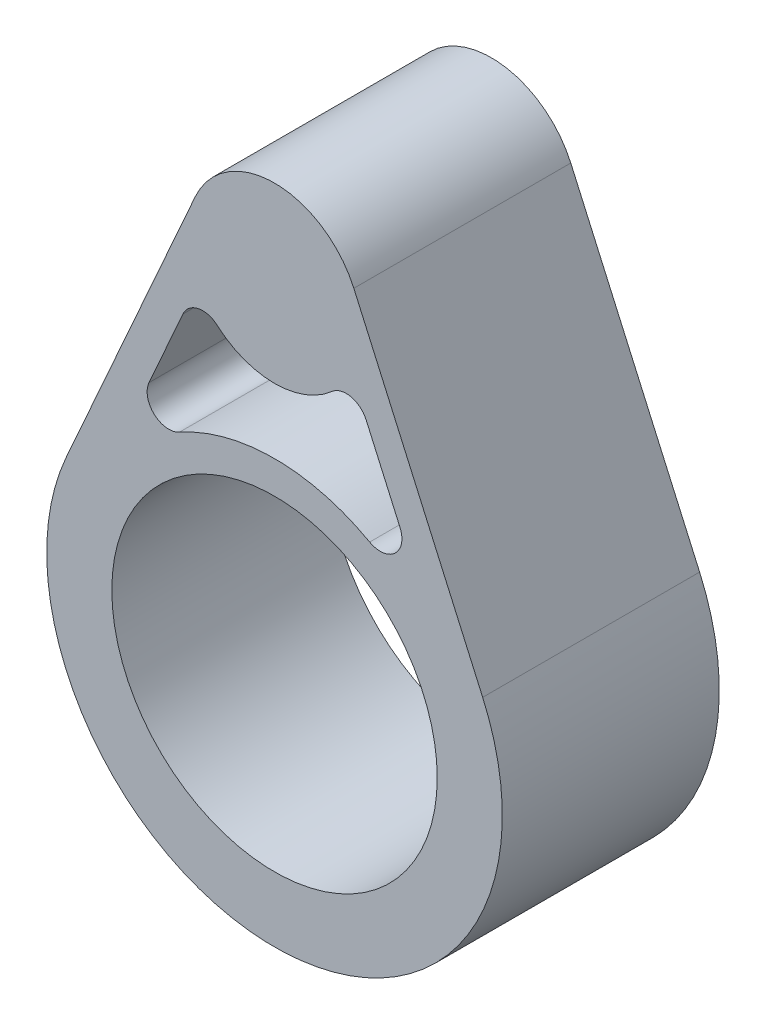
ISO-10303-21;
HEADER;
FILE_DESCRIPTION(('STEP AP214'),'2;1');
FILE_NAME('part.step','',(''),(''),'','','');
FILE_SCHEMA(('AUTOMOTIVE_DESIGN { 1 0 10303 214 1 1 1 1 }'));
ENDSEC;
DATA;
#1=APPLICATION_CONTEXT('core data for automotive mechanical design processes');
#2=APPLICATION_PROTOCOL_DEFINITION('international standard','automotive_design',2000,#1);
#3=PRODUCT_CONTEXT('',#1,'mechanical');
#4=PRODUCT('Part','Part','',(#3));
#5=PRODUCT_RELATED_PRODUCT_CATEGORY('part','',(#4));
#6=PRODUCT_DEFINITION_FORMATION('','',#4);
#7=PRODUCT_DEFINITION_CONTEXT('part definition',#1,'design');
#8=PRODUCT_DEFINITION('design','',#6,#7);
#9=PRODUCT_DEFINITION_SHAPE('','',#8);
#10=(LENGTH_UNIT() NAMED_UNIT(*) SI_UNIT(.MILLI.,.METRE.));
#11=(NAMED_UNIT(*) PLANE_ANGLE_UNIT() SI_UNIT($,.RADIAN.));
#12=(NAMED_UNIT(*) SI_UNIT($,.STERADIAN.) SOLID_ANGLE_UNIT());
#13=UNCERTAINTY_MEASURE_WITH_UNIT(LENGTH_MEASURE(1.E-05),#10,'distance_accuracy_value','');
#14=(GEOMETRIC_REPRESENTATION_CONTEXT(3) GLOBAL_UNCERTAINTY_ASSIGNED_CONTEXT((#13)) GLOBAL_UNIT_ASSIGNED_CONTEXT((#10,
#11,#12)) REPRESENTATION_CONTEXT('',''));
#15=CARTESIAN_POINT('',(0.,0.,0.));
#16=DIRECTION('',(0.,0.,1.));
#17=DIRECTION('',(1.,0.,0.));
#18=AXIS2_PLACEMENT_3D('',#15,#16,#17);
#19=CARTESIAN_POINT('',(0.,-160.,50.));
#20=DIRECTION('',(0.,0.,1.));
#21=DIRECTION('',(1.,0.,0.));
#22=AXIS2_PLACEMENT_3D('',#19,#20,#21);
#23=PLANE('',#22);
#24=CARTESIAN_POINT('',(0.,0.,50.));
#25=DIRECTION('',(0.,0.,-1.));
#26=DIRECTION('',(1.,0.,0.));
#27=AXIS2_PLACEMENT_3D('',#24,#25,#26);
#28=CIRCLE('',#27,40.);
#29=CARTESIAN_POINT('',(26.4666556609354,-29.9919345512335,50.));
#30=VERTEX_POINT('',#29);
#31=CARTESIAN_POINT('',(-26.4666556609355,-29.9919345512335,50.));
#32=VERTEX_POINT('',#31);
#33=EDGE_CURVE('E192',#30,#32,#28,.T.);
#34=ORIENTED_EDGE('',*,*,#33,.F.);
#35=CARTESIAN_POINT('',(33.0833195761693,-37.4899181890419,50.));
#36=DIRECTION('',(0.,0.,1.));
#37=DIRECTION('',(1.,0.,0.));
#38=AXIS2_PLACEMENT_3D('',#35,#36,#37);
#39=CIRCLE('',#38,10.);
#40=CARTESIAN_POINT('',(42.2209392744277,-33.4274181890419,50.));
#41=VERTEX_POINT('',#40);
#42=EDGE_CURVE('E176',#30,#41,#39,.F.);
#43=ORIENTED_EDGE('',*,*,#42,.T.);
#44=DIRECTION('',(-0.40625,0.91376196982584,0.));
#45=VECTOR('',#44,1.);
#46=CARTESIAN_POINT('',(82.2385772843257,-123.4375,50.));
#47=LINE('',#46,#45);
#48=CARTESIAN_POINT('',(57.8635772843256,-68.6117818104496,50.));
#49=VERTEX_POINT('',#48);
#50=EDGE_CURVE('E272',#49,#41,#47,.T.);
#51=ORIENTED_EDGE('',*,*,#50,.F.);
#52=CARTESIAN_POINT('',(48.7259575860672,-72.6742818104496,50.));
#53=DIRECTION('',(0.,0.,1.));
#54=DIRECTION('',(1.,0.,0.));
#55=AXIS2_PLACEMENT_3D('',#52,#53,#54);
#56=CIRCLE('',#55,10.);
#57=CARTESIAN_POINT('',(43.8533618274605,-81.4068536294046,50.));
#58=VERTEX_POINT('',#57);
#59=EDGE_CURVE('E49',#49,#58,#56,.F.);
#60=ORIENTED_EDGE('',*,*,#59,.T.);
#61=CARTESIAN_POINT('',(0.,-160.,50.));
#62=DIRECTION('',(0.,0.,-1.));
#63=DIRECTION('',(1.,0.,0.));
#64=AXIS2_PLACEMENT_3D('',#61,#62,#63);
#65=CIRCLE('',#64,90.);
#66=CARTESIAN_POINT('',(-43.8533618274605,-81.4068536294046,50.));
#67=VERTEX_POINT('',#66);
#68=EDGE_CURVE('E186',#67,#58,#65,.T.);
#69=ORIENTED_EDGE('',*,*,#68,.F.);
#70=CARTESIAN_POINT('',(-48.7259575860672,-72.6742818104496,50.));
#71=DIRECTION('',(0.,0.,1.));
#72=DIRECTION('',(1.,0.,0.));
#73=AXIS2_PLACEMENT_3D('',#70,#71,#72);
#74=CIRCLE('',#73,10.);
#75=CARTESIAN_POINT('',(-57.8635772843256,-68.6117818104496,50.));
#76=VERTEX_POINT('',#75);
#77=EDGE_CURVE('E42',#67,#76,#74,.F.);
#78=ORIENTED_EDGE('',*,*,#77,.T.);
#79=DIRECTION('',(-0.40625,-0.91376196982584,0.));
#80=VECTOR('',#79,1.);
#81=CARTESIAN_POINT('',(-35.5292014298928,-18.3759583628748,50.));
#82=LINE('',#81,#80);
#83=CARTESIAN_POINT('',(-42.2209392744277,-33.4274181890419,50.));
#84=VERTEX_POINT('',#83);
#85=EDGE_CURVE('E185',#84,#76,#82,.T.);
#86=ORIENTED_EDGE('',*,*,#85,.F.);
#87=CARTESIAN_POINT('',(-33.0833195761693,-37.4899181890419,50.));
#88=DIRECTION('',(0.,0.,1.));
#89=DIRECTION('',(1.,0.,0.));
#90=AXIS2_PLACEMENT_3D('',#87,#88,#89);
#91=CIRCLE('',#90,10.);
#92=EDGE_CURVE('E172',#84,#32,#91,.F.);
#93=ORIENTED_EDGE('',*,*,#92,.T.);
#94=EDGE_LOOP('',(#34,#43,#51,#60,#69,#78,#86,#93));
#95=FACE_BOUND('',#94,.T.);
#96=CARTESIAN_POINT('',(0.,-160.,50.));
#97=DIRECTION('',(0.,0.,1.));
#98=DIRECTION('',(1.,0.,0.));
#99=AXIS2_PLACEMENT_3D('',#96,#97,#98);
#100=CIRCLE('',#99,105.);
#101=CARTESIAN_POINT('',(-95.9450068317132,-117.34375,50.));
#102=VERTEX_POINT('',#101);
#103=CARTESIAN_POINT('',(95.9450068317133,-117.34375,50.));
#104=VERTEX_POINT('',#103);
#105=EDGE_CURVE('E134',#102,#104,#100,.T.);
#106=ORIENTED_EDGE('',*,*,#105,.T.);
#107=DIRECTION('',(-0.40625,0.91376196982584,0.));
#108=VECTOR('',#107,1.);
#109=CARTESIAN_POINT('',(36.5504787930336,16.25,50.));
#110=LINE('',#109,#108);
#111=CARTESIAN_POINT('',(36.5504787930336,16.25,50.));
#112=VERTEX_POINT('',#111);
#113=EDGE_CURVE('E123',#104,#112,#110,.T.);
#114=ORIENTED_EDGE('',*,*,#113,.T.);
#115=CARTESIAN_POINT('',(0.,0.,50.));
#116=DIRECTION('',(0.,0.,1.));
#117=DIRECTION('',(1.,0.,0.));
#118=AXIS2_PLACEMENT_3D('',#115,#116,#117);
#119=CIRCLE('',#118,40.);
#120=CARTESIAN_POINT('',(-36.5504787930336,16.25,50.));
#121=VERTEX_POINT('',#120);
#122=EDGE_CURVE('E133',#112,#121,#119,.T.);
#123=ORIENTED_EDGE('',*,*,#122,.T.);
#124=DIRECTION('',(-0.40625,-0.91376196982584,0.));
#125=VECTOR('',#124,1.);
#126=CARTESIAN_POINT('',(-95.9450068317132,-117.34375,50.));
#127=LINE('',#126,#125);
#128=EDGE_CURVE('E139',#121,#102,#127,.T.);
#129=ORIENTED_EDGE('',*,*,#128,.T.);
#130=EDGE_LOOP('',(#106,#114,#123,#129));
#131=FACE_BOUND('',#130,.T.);
#132=CARTESIAN_POINT('',(0.,-160.,50.));
#133=DIRECTION('',(0.,0.,1.));
#134=DIRECTION('',(1.,0.,0.));
#135=AXIS2_PLACEMENT_3D('',#132,#133,#134);
#136=CIRCLE('',#135,75.);
#137=CARTESIAN_POINT('',(75.,-160.,50.));
#138=VERTEX_POINT('',#137);
#139=EDGE_CURVE('E215',#138,#138,#136,.T.);
#140=ORIENTED_EDGE('',*,*,#139,.F.);
#141=EDGE_LOOP('',(#140));
#142=FACE_BOUND('',#141,.T.);
#143=ADVANCED_FACE('F34',(#95,#131,#142),#23,.T.);
#144=CARTESIAN_POINT('',(0.,-160.,-50.));
#145=DIRECTION('',(0.,0.,1.));
#146=DIRECTION('',(1.,0.,0.));
#147=AXIS2_PLACEMENT_3D('',#144,#145,#146);
#148=PLANE('',#147);
#149=CARTESIAN_POINT('',(0.,-160.,-50.));
#150=DIRECTION('',(0.,0.,-1.));
#151=DIRECTION('',(1.,0.,0.));
#152=AXIS2_PLACEMENT_3D('',#149,#150,#151);
#153=CIRCLE('',#152,90.);
#154=CARTESIAN_POINT('',(-43.8533618274605,-81.4068536294046,-50.));
#155=VERTEX_POINT('',#154);
#156=CARTESIAN_POINT('',(43.8533618274605,-81.4068536294046,-50.));
#157=VERTEX_POINT('',#156);
#158=EDGE_CURVE('E200',#155,#157,#153,.T.);
#159=ORIENTED_EDGE('',*,*,#158,.T.);
#160=CARTESIAN_POINT('',(48.7259575860672,-72.6742818104496,-50.));
#161=DIRECTION('',(0.,0.,1.));
#162=DIRECTION('',(1.,0.,0.));
#163=AXIS2_PLACEMENT_3D('',#160,#161,#162);
#164=CIRCLE('',#163,10.);
#165=CARTESIAN_POINT('',(57.8635772843256,-68.6117818104496,-50.));
#166=VERTEX_POINT('',#165);
#167=EDGE_CURVE('E181',#157,#166,#164,.T.);
#168=ORIENTED_EDGE('',*,*,#167,.T.);
#169=DIRECTION('',(-0.40625,0.91376196982584,0.));
#170=VECTOR('',#169,1.);
#171=CARTESIAN_POINT('',(82.2385772843257,-123.4375,-50.));
#172=LINE('',#171,#170);
#173=CARTESIAN_POINT('',(42.2209392744277,-33.4274181890419,-50.));
#174=VERTEX_POINT('',#173);
#175=EDGE_CURVE('E206',#166,#174,#172,.T.);
#176=ORIENTED_EDGE('',*,*,#175,.T.);
#177=CARTESIAN_POINT('',(33.0833195761693,-37.4899181890419,-50.));
#178=DIRECTION('',(0.,0.,1.));
#179=DIRECTION('',(1.,0.,0.));
#180=AXIS2_PLACEMENT_3D('',#177,#178,#179);
#181=CIRCLE('',#180,10.);
#182=CARTESIAN_POINT('',(26.4666556609354,-29.9919345512335,-50.));
#183=VERTEX_POINT('',#182);
#184=EDGE_CURVE('E178',#174,#183,#181,.T.);
#185=ORIENTED_EDGE('',*,*,#184,.T.);
#186=CARTESIAN_POINT('',(0.,0.,-50.));
#187=DIRECTION('',(0.,0.,-1.));
#188=DIRECTION('',(1.,0.,0.));
#189=AXIS2_PLACEMENT_3D('',#186,#187,#188);
#190=CIRCLE('',#189,40.);
#191=CARTESIAN_POINT('',(-26.4666556609355,-29.9919345512335,-50.));
#192=VERTEX_POINT('',#191);
#193=EDGE_CURVE('E211',#183,#192,#190,.T.);
#194=ORIENTED_EDGE('',*,*,#193,.T.);
#195=CARTESIAN_POINT('',(-33.0833195761693,-37.4899181890419,-50.));
#196=DIRECTION('',(0.,0.,1.));
#197=DIRECTION('',(1.,0.,0.));
#198=AXIS2_PLACEMENT_3D('',#195,#196,#197);
#199=CIRCLE('',#198,10.);
#200=CARTESIAN_POINT('',(-42.2209392744277,-33.4274181890419,-50.));
#201=VERTEX_POINT('',#200);
#202=EDGE_CURVE('E174',#192,#201,#199,.T.);
#203=ORIENTED_EDGE('',*,*,#202,.T.);
#204=DIRECTION('',(-0.40625,-0.91376196982584,0.));
#205=VECTOR('',#204,1.);
#206=CARTESIAN_POINT('',(-35.5292014298928,-18.3759583628748,-50.));
#207=LINE('',#206,#205);
#208=CARTESIAN_POINT('',(-57.8635772843256,-68.6117818104496,-50.));
#209=VERTEX_POINT('',#208);
#210=EDGE_CURVE('E202',#201,#209,#207,.T.);
#211=ORIENTED_EDGE('',*,*,#210,.T.);
#212=CARTESIAN_POINT('',(-48.7259575860672,-72.6742818104496,-50.));
#213=DIRECTION('',(0.,0.,1.));
#214=DIRECTION('',(1.,0.,0.));
#215=AXIS2_PLACEMENT_3D('',#212,#213,#214);
#216=CIRCLE('',#215,10.);
#217=EDGE_CURVE('E11',#209,#155,#216,.T.);
#218=ORIENTED_EDGE('',*,*,#217,.T.);
#219=EDGE_LOOP('',(#159,#168,#176,#185,#194,#203,#211,#218));
#220=FACE_BOUND('',#219,.T.);
#221=CARTESIAN_POINT('',(0.,-160.,-50.));
#222=DIRECTION('',(0.,0.,1.));
#223=DIRECTION('',(1.,0.,0.));
#224=AXIS2_PLACEMENT_3D('',#221,#222,#223);
#225=CIRCLE('',#224,105.);
#226=CARTESIAN_POINT('',(-95.9450068317132,-117.34375,-50.));
#227=VERTEX_POINT('',#226);
#228=CARTESIAN_POINT('',(95.9450068317133,-117.34375,-50.));
#229=VERTEX_POINT('',#228);
#230=EDGE_CURVE('E147',#227,#229,#225,.T.);
#231=ORIENTED_EDGE('',*,*,#230,.F.);
#232=DIRECTION('',(-0.40625,-0.91376196982584,0.));
#233=VECTOR('',#232,1.);
#234=CARTESIAN_POINT('',(-95.9450068317132,-117.34375,-50.));
#235=LINE('',#234,#233);
#236=CARTESIAN_POINT('',(-36.5504787930336,16.25,-50.));
#237=VERTEX_POINT('',#236);
#238=EDGE_CURVE('E143',#237,#227,#235,.T.);
#239=ORIENTED_EDGE('',*,*,#238,.F.);
#240=CARTESIAN_POINT('',(0.,0.,-50.));
#241=DIRECTION('',(0.,0.,1.));
#242=DIRECTION('',(1.,0.,0.));
#243=AXIS2_PLACEMENT_3D('',#240,#241,#242);
#244=CIRCLE('',#243,40.);
#245=CARTESIAN_POINT('',(36.5504787930336,16.25,-50.));
#246=VERTEX_POINT('',#245);
#247=EDGE_CURVE('E226',#246,#237,#244,.T.);
#248=ORIENTED_EDGE('',*,*,#247,.F.);
#249=DIRECTION('',(-0.40625,0.91376196982584,0.));
#250=VECTOR('',#249,1.);
#251=CARTESIAN_POINT('',(36.5504787930336,16.25,-50.));
#252=LINE('',#251,#250);
#253=EDGE_CURVE('E224',#229,#246,#252,.T.);
#254=ORIENTED_EDGE('',*,*,#253,.F.);
#255=EDGE_LOOP('',(#231,#239,#248,#254));
#256=FACE_BOUND('',#255,.T.);
#257=CARTESIAN_POINT('',(0.,-160.,-50.));
#258=DIRECTION('',(0.,0.,1.));
#259=DIRECTION('',(1.,0.,0.));
#260=AXIS2_PLACEMENT_3D('',#257,#258,#259);
#261=CIRCLE('',#260,75.);
#262=CARTESIAN_POINT('',(75.,-160.,-50.));
#263=VERTEX_POINT('',#262);
#264=EDGE_CURVE('E209',#263,#263,#261,.T.);
#265=ORIENTED_EDGE('',*,*,#264,.T.);
#266=EDGE_LOOP('',(#265));
#267=FACE_BOUND('',#266,.T.);
#268=ADVANCED_FACE('F198',(#220,#256,#267),#148,.F.);
#269=CARTESIAN_POINT('',(0.,-160.,50.));
#270=DIRECTION('',(0.,0.,-1.));
#271=DIRECTION('',(-1.,0.,0.));
#272=AXIS2_PLACEMENT_3D('',#269,#270,#271);
#273=CYLINDRICAL_SURFACE('',#272,105.);
#274=ORIENTED_EDGE('',*,*,#230,.T.);
#275=DIRECTION('',(0.,0.,-1.));
#276=VECTOR('',#275,1.);
#277=CARTESIAN_POINT('',(95.9450068317133,-117.34375,50.));
#278=LINE('',#277,#276);
#279=EDGE_CURVE('E127',#104,#229,#278,.T.);
#280=ORIENTED_EDGE('',*,*,#279,.F.);
#281=ORIENTED_EDGE('',*,*,#105,.F.);
#282=DIRECTION('',(0.,0.,-1.));
#283=VECTOR('',#282,1.);
#284=CARTESIAN_POINT('',(-95.9450068317132,-117.34375,50.));
#285=LINE('',#284,#283);
#286=EDGE_CURVE('E222',#102,#227,#285,.T.);
#287=ORIENTED_EDGE('',*,*,#286,.T.);
#288=EDGE_LOOP('',(#274,#280,#281,#287));
#289=FACE_BOUND('',#288,.T.);
#290=ADVANCED_FACE('F145',(#289),#273,.T.);
#291=CARTESIAN_POINT('',(36.5504787930336,16.25,50.));
#292=DIRECTION('',(-0.91376196982584,-0.40625,0.));
#293=DIRECTION('',(0.40625,-0.91376196982584,0.));
#294=AXIS2_PLACEMENT_3D('',#291,#292,#293);
#295=PLANE('',#294);
#296=ORIENTED_EDGE('',*,*,#253,.T.);
#297=DIRECTION('',(0.,0.,-1.));
#298=VECTOR('',#297,1.);
#299=CARTESIAN_POINT('',(36.5504787930336,16.25,50.));
#300=LINE('',#299,#298);
#301=EDGE_CURVE('E130',#112,#246,#300,.T.);
#302=ORIENTED_EDGE('',*,*,#301,.F.);
#303=ORIENTED_EDGE('',*,*,#113,.F.);
#304=ORIENTED_EDGE('',*,*,#279,.T.);
#305=EDGE_LOOP('',(#296,#302,#303,#304));
#306=FACE_BOUND('',#305,.T.);
#307=ADVANCED_FACE('F125',(#306),#295,.F.);
#308=CARTESIAN_POINT('',(0.,0.,50.));
#309=DIRECTION('',(0.,0.,-1.));
#310=DIRECTION('',(-1.,0.,0.));
#311=AXIS2_PLACEMENT_3D('',#308,#309,#310);
#312=CYLINDRICAL_SURFACE('',#311,40.);
#313=ORIENTED_EDGE('',*,*,#247,.T.);
#314=DIRECTION('',(0.,0.,-1.));
#315=VECTOR('',#314,1.);
#316=CARTESIAN_POINT('',(-36.5504787930336,16.25,50.));
#317=LINE('',#316,#315);
#318=EDGE_CURVE('E152',#121,#237,#317,.T.);
#319=ORIENTED_EDGE('',*,*,#318,.F.);
#320=ORIENTED_EDGE('',*,*,#122,.F.);
#321=ORIENTED_EDGE('',*,*,#301,.T.);
#322=EDGE_LOOP('',(#313,#319,#320,#321));
#323=FACE_BOUND('',#322,.T.);
#324=ADVANCED_FACE('F237',(#323),#312,.T.);
#325=CARTESIAN_POINT('',(-95.9450068317132,-117.34375,50.));
#326=DIRECTION('',(0.91376196982584,-0.40625,0.));
#327=DIRECTION('',(0.40625,0.91376196982584,0.));
#328=AXIS2_PLACEMENT_3D('',#325,#326,#327);
#329=PLANE('',#328);
#330=ORIENTED_EDGE('',*,*,#238,.T.);
#331=ORIENTED_EDGE('',*,*,#286,.F.);
#332=ORIENTED_EDGE('',*,*,#128,.F.);
#333=ORIENTED_EDGE('',*,*,#318,.T.);
#334=EDGE_LOOP('',(#330,#331,#332,#333));
#335=FACE_BOUND('',#334,.T.);
#336=ADVANCED_FACE('F233',(#335),#329,.F.);
#337=CARTESIAN_POINT('',(0.,-160.,50.));
#338=DIRECTION('',(0.,0.,-1.));
#339=DIRECTION('',(-1.,0.,0.));
#340=AXIS2_PLACEMENT_3D('',#337,#338,#339);
#341=CYLINDRICAL_SURFACE('',#340,75.);
#342=ORIENTED_EDGE('',*,*,#139,.T.);
#343=EDGE_LOOP('',(#342));
#344=FACE_BOUND('',#343,.T.);
#345=ORIENTED_EDGE('',*,*,#264,.F.);
#346=EDGE_LOOP('',(#345));
#347=FACE_BOUND('',#346,.T.);
#348=ADVANCED_FACE('F244',(#344,#347),#341,.F.);
#349=CARTESIAN_POINT('',(0.,0.,-50.));
#350=DIRECTION('',(0.,0.,1.));
#351=DIRECTION('',(1.,0.,0.));
#352=AXIS2_PLACEMENT_3D('',#349,#350,#351);
#353=CYLINDRICAL_SURFACE('',#352,40.);
#354=ORIENTED_EDGE('',*,*,#33,.T.);
#355=DIRECTION('',(0.,0.,1.));
#356=VECTOR('',#355,1.);
#357=CARTESIAN_POINT('',(-26.4666556609355,-29.9919345512335,-50.));
#358=LINE('',#357,#356);
#359=EDGE_CURVE('E161',#32,#192,#358,.F.);
#360=ORIENTED_EDGE('',*,*,#359,.T.);
#361=ORIENTED_EDGE('',*,*,#193,.F.);
#362=DIRECTION('',(0.,0.,1.));
#363=VECTOR('',#362,1.);
#364=CARTESIAN_POINT('',(26.4666556609354,-29.9919345512335,-50.));
#365=LINE('',#364,#363);
#366=EDGE_CURVE('E158',#183,#30,#365,.T.);
#367=ORIENTED_EDGE('',*,*,#366,.T.);
#368=EDGE_LOOP('',(#354,#360,#361,#367));
#369=FACE_BOUND('',#368,.T.);
#370=ADVANCED_FACE('F256',(#369),#353,.T.);
#371=CARTESIAN_POINT('',(82.2385772843257,-123.4375,-50.));
#372=DIRECTION('',(0.91376196982584,0.40625,0.));
#373=DIRECTION('',(-0.40625,0.91376196982584,0.));
#374=AXIS2_PLACEMENT_3D('',#371,#372,#373);
#375=PLANE('',#374);
#376=ORIENTED_EDGE('',*,*,#50,.T.);
#377=DIRECTION('',(0.,0.,-1.));
#378=VECTOR('',#377,1.);
#379=CARTESIAN_POINT('',(42.2209392744277,-33.4274181890419,-50.));
#380=LINE('',#379,#378);
#381=EDGE_CURVE('E166',#41,#174,#380,.T.);
#382=ORIENTED_EDGE('',*,*,#381,.T.);
#383=ORIENTED_EDGE('',*,*,#175,.F.);
#384=DIRECTION('',(0.,0.,-1.));
#385=VECTOR('',#384,1.);
#386=CARTESIAN_POINT('',(57.8635772843256,-68.6117818104496,50.));
#387=LINE('',#386,#385);
#388=EDGE_CURVE('E163',#166,#49,#387,.F.);
#389=ORIENTED_EDGE('',*,*,#388,.T.);
#390=EDGE_LOOP('',(#376,#382,#383,#389));
#391=FACE_BOUND('',#390,.T.);
#392=ADVANCED_FACE('F260',(#391),#375,.F.);
#393=CARTESIAN_POINT('',(0.,-160.,-50.));
#394=DIRECTION('',(0.,0.,1.));
#395=DIRECTION('',(1.,0.,0.));
#396=AXIS2_PLACEMENT_3D('',#393,#394,#395);
#397=CYLINDRICAL_SURFACE('',#396,90.);
#398=ORIENTED_EDGE('',*,*,#68,.T.);
#399=DIRECTION('',(0.,0.,1.));
#400=VECTOR('',#399,1.);
#401=CARTESIAN_POINT('',(43.8533618274605,-81.4068536294046,-50.));
#402=LINE('',#401,#400);
#403=EDGE_CURVE('E170',#58,#157,#402,.F.);
#404=ORIENTED_EDGE('',*,*,#403,.T.);
#405=ORIENTED_EDGE('',*,*,#158,.F.);
#406=DIRECTION('',(0.,0.,1.));
#407=VECTOR('',#406,1.);
#408=CARTESIAN_POINT('',(-43.8533618274605,-81.4068536294046,-50.));
#409=LINE('',#408,#407);
#410=EDGE_CURVE('E168',#155,#67,#409,.T.);
#411=ORIENTED_EDGE('',*,*,#410,.T.);
#412=EDGE_LOOP('',(#398,#404,#405,#411));
#413=FACE_BOUND('',#412,.T.);
#414=ADVANCED_FACE('F204',(#413),#397,.T.);
#415=CARTESIAN_POINT('',(-35.5292014298928,-18.3759583628748,-50.));
#416=DIRECTION('',(-0.91376196982584,0.40625,0.));
#417=DIRECTION('',(-0.40625,-0.91376196982584,0.));
#418=AXIS2_PLACEMENT_3D('',#415,#416,#417);
#419=PLANE('',#418);
#420=ORIENTED_EDGE('',*,*,#210,.F.);
#421=DIRECTION('',(0.,0.,-1.));
#422=VECTOR('',#421,1.);
#423=CARTESIAN_POINT('',(-42.2209392744277,-33.4274181890419,50.));
#424=LINE('',#423,#422);
#425=EDGE_CURVE('E150',#201,#84,#424,.F.);
#426=ORIENTED_EDGE('',*,*,#425,.T.);
#427=ORIENTED_EDGE('',*,*,#85,.T.);
#428=DIRECTION('',(0.,0.,-1.));
#429=VECTOR('',#428,1.);
#430=CARTESIAN_POINT('',(-57.8635772843256,-68.6117818104496,-50.));
#431=LINE('',#430,#429);
#432=EDGE_CURVE('E148',#76,#209,#431,.T.);
#433=ORIENTED_EDGE('',*,*,#432,.T.);
#434=EDGE_LOOP('',(#420,#426,#427,#433));
#435=FACE_BOUND('',#434,.T.);
#436=ADVANCED_FACE('F189',(#435),#419,.F.);
#437=CARTESIAN_POINT('',(-33.0833195761693,-37.4899181890419,-50.));
#438=DIRECTION('',(0.,0.,1.));
#439=DIRECTION('',(1.,0.,0.));
#440=AXIS2_PLACEMENT_3D('',#437,#438,#439);
#441=CYLINDRICAL_SURFACE('',#440,10.);
#442=ORIENTED_EDGE('',*,*,#202,.F.);
#443=ORIENTED_EDGE('',*,*,#359,.F.);
#444=ORIENTED_EDGE('',*,*,#92,.F.);
#445=ORIENTED_EDGE('',*,*,#425,.F.);
#446=EDGE_LOOP('',(#442,#443,#444,#445));
#447=FACE_BOUND('',#446,.T.);
#448=ADVANCED_FACE('F264',(#447),#441,.F.);
#449=CARTESIAN_POINT('',(33.0833195761693,-37.4899181890419,-50.));
#450=DIRECTION('',(0.,0.,1.));
#451=DIRECTION('',(1.,0.,0.));
#452=AXIS2_PLACEMENT_3D('',#449,#450,#451);
#453=CYLINDRICAL_SURFACE('',#452,10.);
#454=ORIENTED_EDGE('',*,*,#184,.F.);
#455=ORIENTED_EDGE('',*,*,#381,.F.);
#456=ORIENTED_EDGE('',*,*,#42,.F.);
#457=ORIENTED_EDGE('',*,*,#366,.F.);
#458=EDGE_LOOP('',(#454,#455,#456,#457));
#459=FACE_BOUND('',#458,.T.);
#460=ADVANCED_FACE('F279',(#459),#453,.F.);
#461=CARTESIAN_POINT('',(48.7259575860672,-72.6742818104496,-50.));
#462=DIRECTION('',(0.,0.,1.));
#463=DIRECTION('',(1.,0.,0.));
#464=AXIS2_PLACEMENT_3D('',#461,#462,#463);
#465=CYLINDRICAL_SURFACE('',#464,10.);
#466=ORIENTED_EDGE('',*,*,#167,.F.);
#467=ORIENTED_EDGE('',*,*,#403,.F.);
#468=ORIENTED_EDGE('',*,*,#59,.F.);
#469=ORIENTED_EDGE('',*,*,#388,.F.);
#470=EDGE_LOOP('',(#466,#467,#468,#469));
#471=FACE_BOUND('',#470,.T.);
#472=ADVANCED_FACE('F294',(#471),#465,.F.);
#473=CARTESIAN_POINT('',(-48.7259575860672,-72.6742818104496,-50.));
#474=DIRECTION('',(0.,0.,1.));
#475=DIRECTION('',(1.,0.,0.));
#476=AXIS2_PLACEMENT_3D('',#473,#474,#475);
#477=CYLINDRICAL_SURFACE('',#476,10.);
#478=ORIENTED_EDGE('',*,*,#217,.F.);
#479=ORIENTED_EDGE('',*,*,#432,.F.);
#480=ORIENTED_EDGE('',*,*,#77,.F.);
#481=ORIENTED_EDGE('',*,*,#410,.F.);
#482=EDGE_LOOP('',(#478,#479,#480,#481));
#483=FACE_BOUND('',#482,.T.);
#484=ADVANCED_FACE('F36',(#483),#477,.F.);
#485=CLOSED_SHELL('',(#143,#268,#290,#307,#324,#336,#348,#370,#392,#414,#436,#448,#460,#472,#484));
#486=MANIFOLD_SOLID_BREP('B2',#485);
#487=ADVANCED_BREP_SHAPE_REPRESENTATION('',(#18,#486),#14);
#488=SHAPE_DEFINITION_REPRESENTATION(#9,#487);
ENDSEC;
END-ISO-10303-21;
